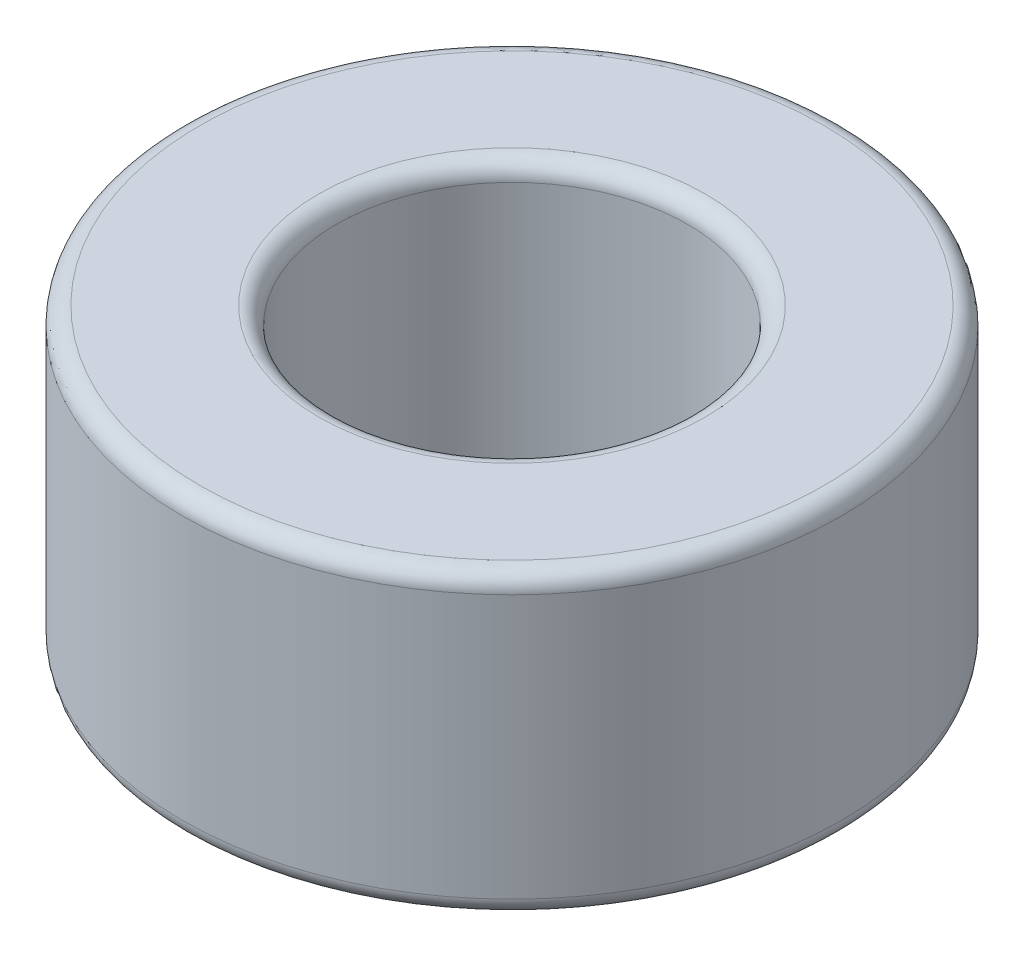
ISO-10303-21;
HEADER;
FILE_DESCRIPTION(('STEP AP214'),'2;1');
FILE_NAME('part.step','',(''),(''),'','','');
FILE_SCHEMA(('AUTOMOTIVE_DESIGN { 1 0 10303 214 1 1 1 1 }'));
ENDSEC;
DATA;
#1=APPLICATION_CONTEXT('core data for automotive mechanical design processes');
#2=APPLICATION_PROTOCOL_DEFINITION('international standard','automotive_design',2000,#1);
#3=PRODUCT_CONTEXT('',#1,'mechanical');
#4=PRODUCT('Part','Part','',(#3));
#5=PRODUCT_RELATED_PRODUCT_CATEGORY('part','',(#4));
#6=PRODUCT_DEFINITION_FORMATION('','',#4);
#7=PRODUCT_DEFINITION_CONTEXT('part definition',#1,'design');
#8=PRODUCT_DEFINITION('design','',#6,#7);
#9=PRODUCT_DEFINITION_SHAPE('','',#8);
#10=(LENGTH_UNIT() NAMED_UNIT(*) SI_UNIT(.MILLI.,.METRE.));
#11=(NAMED_UNIT(*) PLANE_ANGLE_UNIT() SI_UNIT($,.RADIAN.));
#12=(NAMED_UNIT(*) SI_UNIT($,.STERADIAN.) SOLID_ANGLE_UNIT());
#13=UNCERTAINTY_MEASURE_WITH_UNIT(LENGTH_MEASURE(1.E-05),#10,'distance_accuracy_value','');
#14=(GEOMETRIC_REPRESENTATION_CONTEXT(3) GLOBAL_UNCERTAINTY_ASSIGNED_CONTEXT((#13)) GLOBAL_UNIT_ASSIGNED_CONTEXT((#10,
#11,#12)) REPRESENTATION_CONTEXT('',''));
#15=CARTESIAN_POINT('',(0.,0.,0.));
#16=DIRECTION('',(0.,0.,1.));
#17=DIRECTION('',(1.,0.,0.));
#18=AXIS2_PLACEMENT_3D('',#15,#16,#17);
#19=CARTESIAN_POINT('',(0.,8.636,0.));
#20=DIRECTION('',(0.,1.,0.));
#21=DIRECTION('',(0.,0.,1.));
#22=AXIS2_PLACEMENT_3D('',#19,#20,#21);
#23=PLANE('',#22);
#24=CARTESIAN_POINT('',(0.,8.636,0.));
#25=DIRECTION('',(0.,1.,0.));
#26=DIRECTION('',(0.,0.,1.));
#27=AXIS2_PLACEMENT_3D('',#24,#25,#26);
#28=CIRCLE('',#27,5.588);
#29=CARTESIAN_POINT('',(0.,8.636,5.588));
#30=VERTEX_POINT('',#29);
#31=EDGE_CURVE('E64',#30,#30,#28,.F.);
#32=ORIENTED_EDGE('',*,*,#31,.T.);
#33=EDGE_LOOP('',(#32));
#34=FACE_BOUND('',#33,.T.);
#35=CARTESIAN_POINT('',(0.,8.636,0.));
#36=DIRECTION('',(0.,1.,0.));
#37=DIRECTION('',(0.,0.,1.));
#38=AXIS2_PLACEMENT_3D('',#35,#36,#37);
#39=CIRCLE('',#38,9.017);
#40=CARTESIAN_POINT('',(0.,8.636,9.017));
#41=VERTEX_POINT('',#40);
#42=EDGE_CURVE('E68',#41,#41,#39,.T.);
#43=ORIENTED_EDGE('',*,*,#42,.T.);
#44=EDGE_LOOP('',(#43));
#45=FACE_BOUND('',#44,.T.);
#46=ADVANCED_FACE('F40',(#34,#45),#23,.T.);
#47=CARTESIAN_POINT('',(0.,0.,0.));
#48=DIRECTION('',(0.,1.,0.));
#49=DIRECTION('',(0.,0.,1.));
#50=AXIS2_PLACEMENT_3D('',#47,#48,#49);
#51=PLANE('',#50);
#52=CARTESIAN_POINT('',(0.,0.,0.));
#53=DIRECTION('',(0.,1.,0.));
#54=DIRECTION('',(0.,0.,1.));
#55=AXIS2_PLACEMENT_3D('',#52,#53,#54);
#56=CIRCLE('',#55,5.588);
#57=CARTESIAN_POINT('',(0.,0.,5.588));
#58=VERTEX_POINT('',#57);
#59=EDGE_CURVE('E10',#58,#58,#56,.T.);
#60=ORIENTED_EDGE('',*,*,#59,.T.);
#61=EDGE_LOOP('',(#60));
#62=FACE_BOUND('',#61,.T.);
#63=CARTESIAN_POINT('',(0.,0.,0.));
#64=DIRECTION('',(0.,1.,0.));
#65=DIRECTION('',(0.,0.,1.));
#66=AXIS2_PLACEMENT_3D('',#63,#64,#65);
#67=CIRCLE('',#66,9.017);
#68=CARTESIAN_POINT('',(0.,0.,9.017));
#69=VERTEX_POINT('',#68);
#70=EDGE_CURVE('E48',#69,#69,#67,.F.);
#71=ORIENTED_EDGE('',*,*,#70,.T.);
#72=EDGE_LOOP('',(#71));
#73=FACE_BOUND('',#72,.T.);
#74=ADVANCED_FACE('F96',(#62,#73),#51,.F.);
#75=CARTESIAN_POINT('',(0.,8.636,0.));
#76=DIRECTION('',(0.,-1.,0.));
#77=DIRECTION('',(0.,0.,-1.));
#78=AXIS2_PLACEMENT_3D('',#75,#76,#77);
#79=CYLINDRICAL_SURFACE('',#78,9.525);
#80=CARTESIAN_POINT('',(0.,8.128,0.));
#81=DIRECTION('',(0.,1.,0.));
#82=DIRECTION('',(0.,0.,1.));
#83=AXIS2_PLACEMENT_3D('',#80,#81,#82);
#84=CIRCLE('',#83,9.525);
#85=CARTESIAN_POINT('',(0.,8.128,9.525));
#86=VERTEX_POINT('',#85);
#87=EDGE_CURVE('E53',#86,#86,#84,.F.);
#88=ORIENTED_EDGE('',*,*,#87,.T.);
#89=EDGE_LOOP('',(#88));
#90=FACE_BOUND('',#89,.T.);
#91=CARTESIAN_POINT('',(0.,0.508,0.));
#92=DIRECTION('',(0.,1.,0.));
#93=DIRECTION('',(0.,0.,1.));
#94=AXIS2_PLACEMENT_3D('',#91,#92,#93);
#95=CIRCLE('',#94,9.525);
#96=CARTESIAN_POINT('',(0.,0.508,9.525));
#97=VERTEX_POINT('',#96);
#98=EDGE_CURVE('E58',#97,#97,#95,.T.);
#99=ORIENTED_EDGE('',*,*,#98,.T.);
#100=EDGE_LOOP('',(#99));
#101=FACE_BOUND('',#100,.T.);
#102=ADVANCED_FACE('F102',(#90,#101),#79,.T.);
#103=CARTESIAN_POINT('',(0.,8.636,0.));
#104=DIRECTION('',(0.,-1.,0.));
#105=DIRECTION('',(0.,0.,-1.));
#106=AXIS2_PLACEMENT_3D('',#103,#104,#105);
#107=CYLINDRICAL_SURFACE('',#106,5.08);
#108=CARTESIAN_POINT('',(0.,8.128,0.));
#109=DIRECTION('',(0.,1.,0.));
#110=DIRECTION('',(0.,0.,1.));
#111=AXIS2_PLACEMENT_3D('',#108,#109,#110);
#112=CIRCLE('',#111,5.08);
#113=CARTESIAN_POINT('',(0.,8.128,5.08));
#114=VERTEX_POINT('',#113);
#115=EDGE_CURVE('E72',#114,#114,#112,.T.);
#116=ORIENTED_EDGE('',*,*,#115,.T.);
#117=EDGE_LOOP('',(#116));
#118=FACE_BOUND('',#117,.T.);
#119=CARTESIAN_POINT('',(0.,0.508,0.));
#120=DIRECTION('',(0.,1.,0.));
#121=DIRECTION('',(0.,0.,1.));
#122=AXIS2_PLACEMENT_3D('',#119,#120,#121);
#123=CIRCLE('',#122,5.08);
#124=CARTESIAN_POINT('',(0.,0.508,5.08));
#125=VERTEX_POINT('',#124);
#126=EDGE_CURVE('E76',#125,#125,#123,.F.);
#127=ORIENTED_EDGE('',*,*,#126,.T.);
#128=EDGE_LOOP('',(#127));
#129=FACE_BOUND('',#128,.T.);
#130=ADVANCED_FACE('F81',(#118,#129),#107,.F.);
#131=CARTESIAN_POINT('',(0.,8.128,0.));
#132=DIRECTION('',(0.,1.,0.));
#133=DIRECTION('',(0.,0.,1.));
#134=AXIS2_PLACEMENT_3D('',#131,#132,#133);
#135=TOROIDAL_SURFACE('',#134,5.588,0.508);
#136=ORIENTED_EDGE('',*,*,#31,.F.);
#137=EDGE_LOOP('',(#136));
#138=FACE_BOUND('',#137,.T.);
#139=ORIENTED_EDGE('',*,*,#115,.F.);
#140=EDGE_LOOP('',(#139));
#141=FACE_BOUND('',#140,.T.);
#142=ADVANCED_FACE('F92',(#138,#141),#135,.T.);
#143=CARTESIAN_POINT('',(0.,8.128,0.));
#144=DIRECTION('',(0.,1.,0.));
#145=DIRECTION('',(0.,0.,1.));
#146=AXIS2_PLACEMENT_3D('',#143,#144,#145);
#147=TOROIDAL_SURFACE('',#146,9.017,0.508);
#148=ORIENTED_EDGE('',*,*,#87,.F.);
#149=EDGE_LOOP('',(#148));
#150=FACE_BOUND('',#149,.T.);
#151=ORIENTED_EDGE('',*,*,#42,.F.);
#152=EDGE_LOOP('',(#151));
#153=FACE_BOUND('',#152,.T.);
#154=ADVANCED_FACE('F86',(#150,#153),#147,.T.);
#155=CARTESIAN_POINT('',(0.,0.508,0.));
#156=DIRECTION('',(0.,1.,0.));
#157=DIRECTION('',(0.,0.,1.));
#158=AXIS2_PLACEMENT_3D('',#155,#156,#157);
#159=TOROIDAL_SURFACE('',#158,5.588,0.508);
#160=ORIENTED_EDGE('',*,*,#126,.F.);
#161=EDGE_LOOP('',(#160));
#162=FACE_BOUND('',#161,.T.);
#163=ORIENTED_EDGE('',*,*,#59,.F.);
#164=EDGE_LOOP('',(#163));
#165=FACE_BOUND('',#164,.T.);
#166=ADVANCED_FACE('F83',(#162,#165),#159,.T.);
#167=CARTESIAN_POINT('',(0.,0.508,0.));
#168=DIRECTION('',(0.,1.,0.));
#169=DIRECTION('',(0.,0.,1.));
#170=AXIS2_PLACEMENT_3D('',#167,#168,#169);
#171=TOROIDAL_SURFACE('',#170,9.017,0.508);
#172=ORIENTED_EDGE('',*,*,#70,.F.);
#173=EDGE_LOOP('',(#172));
#174=FACE_BOUND('',#173,.T.);
#175=ORIENTED_EDGE('',*,*,#98,.F.);
#176=EDGE_LOOP('',(#175));
#177=FACE_BOUND('',#176,.T.);
#178=ADVANCED_FACE('F42',(#174,#177),#171,.T.);
#179=CLOSED_SHELL('',(#46,#74,#102,#130,#142,#154,#166,#178));
#180=MANIFOLD_SOLID_BREP('B2',#179);
#181=ADVANCED_BREP_SHAPE_REPRESENTATION('',(#18,#180),#14);
#182=SHAPE_DEFINITION_REPRESENTATION(#9,#181);
ENDSEC;
END-ISO-10303-21;
